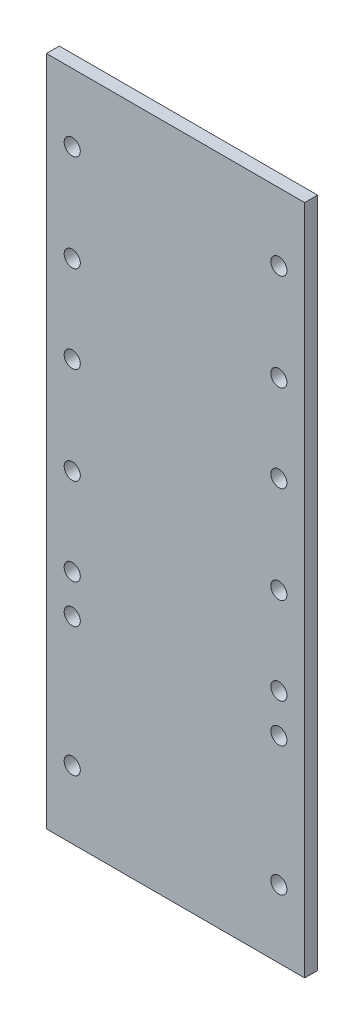
ISO-10303-21;
HEADER;
FILE_DESCRIPTION(('STEP AP214'),'2;1');
FILE_NAME('part.step','',(''),(''),'','','');
FILE_SCHEMA(('AUTOMOTIVE_DESIGN { 1 0 10303 214 1 1 1 1 }'));
ENDSEC;
DATA;
#1=APPLICATION_CONTEXT('core data for automotive mechanical design processes');
#2=APPLICATION_PROTOCOL_DEFINITION('international standard','automotive_design',2000,#1);
#3=PRODUCT_CONTEXT('',#1,'mechanical');
#4=PRODUCT('Part','Part','',(#3));
#5=PRODUCT_RELATED_PRODUCT_CATEGORY('part','',(#4));
#6=PRODUCT_DEFINITION_FORMATION('','',#4);
#7=PRODUCT_DEFINITION_CONTEXT('part definition',#1,'design');
#8=PRODUCT_DEFINITION('design','',#6,#7);
#9=PRODUCT_DEFINITION_SHAPE('','',#8);
#10=(LENGTH_UNIT() NAMED_UNIT(*) SI_UNIT(.MILLI.,.METRE.));
#11=(NAMED_UNIT(*) PLANE_ANGLE_UNIT() SI_UNIT($,.RADIAN.));
#12=(NAMED_UNIT(*) SI_UNIT($,.STERADIAN.) SOLID_ANGLE_UNIT());
#13=UNCERTAINTY_MEASURE_WITH_UNIT(LENGTH_MEASURE(1.E-05),#10,'distance_accuracy_value','');
#14=(GEOMETRIC_REPRESENTATION_CONTEXT(3) GLOBAL_UNCERTAINTY_ASSIGNED_CONTEXT((#13)) GLOBAL_UNIT_ASSIGNED_CONTEXT((#10,
#11,#12)) REPRESENTATION_CONTEXT('',''));
#15=CARTESIAN_POINT('',(0.,0.,0.));
#16=DIRECTION('',(0.,0.,1.));
#17=DIRECTION('',(1.,0.,0.));
#18=AXIS2_PLACEMENT_3D('',#15,#16,#17);
#19=CARTESIAN_POINT('',(0.,0.,4.));
#20=DIRECTION('',(0.,0.,1.));
#21=DIRECTION('',(1.,0.,0.));
#22=AXIS2_PLACEMENT_3D('',#19,#20,#21);
#23=PLANE('',#22);
#24=CARTESIAN_POINT('',(89.9081608098103,-91.7509432379259,4.));
#25=DIRECTION('',(0.,0.,1.));
#26=DIRECTION('',(1.,0.,0.));
#27=AXIS2_PLACEMENT_3D('',#24,#25,#26);
#28=CIRCLE('',#27,2.5);
#29=CARTESIAN_POINT('',(92.4081608098103,-91.7509432379259,4.));
#30=VERTEX_POINT('',#29);
#31=EDGE_CURVE('E191',#30,#30,#28,.T.);
#32=ORIENTED_EDGE('',*,*,#31,.F.);
#33=EDGE_LOOP('',(#32));
#34=FACE_BOUND('',#33,.T.);
#35=CARTESIAN_POINT('',(89.9081608098103,-34.7509432379258,4.));
#36=DIRECTION('',(0.,0.,1.));
#37=DIRECTION('',(1.,0.,0.));
#38=AXIS2_PLACEMENT_3D('',#35,#36,#37);
#39=CIRCLE('',#38,2.5);
#40=CARTESIAN_POINT('',(92.4081608098103,-34.7509432379258,4.));
#41=VERTEX_POINT('',#40);
#42=EDGE_CURVE('E179',#41,#41,#39,.T.);
#43=ORIENTED_EDGE('',*,*,#42,.F.);
#44=EDGE_LOOP('',(#43));
#45=FACE_BOUND('',#44,.T.);
#46=CARTESIAN_POINT('',(89.9081608098103,-61.7509432379258,4.));
#47=DIRECTION('',(0.,0.,1.));
#48=DIRECTION('',(1.,0.,0.));
#49=AXIS2_PLACEMENT_3D('',#46,#47,#48);
#50=CIRCLE('',#49,2.5);
#51=CARTESIAN_POINT('',(92.4081608098103,-61.7509432379258,4.));
#52=VERTEX_POINT('',#51);
#53=EDGE_CURVE('E167',#52,#52,#50,.T.);
#54=ORIENTED_EDGE('',*,*,#53,.F.);
#55=EDGE_LOOP('',(#54));
#56=FACE_BOUND('',#55,.T.);
#57=CARTESIAN_POINT('',(89.9081608098103,-118.750943237926,4.));
#58=DIRECTION('',(0.,0.,1.));
#59=DIRECTION('',(1.,0.,0.));
#60=AXIS2_PLACEMENT_3D('',#57,#58,#59);
#61=CIRCLE('',#60,2.5);
#62=CARTESIAN_POINT('',(92.4081608098103,-118.750943237926,4.));
#63=VERTEX_POINT('',#62);
#64=EDGE_CURVE('E155',#63,#63,#61,.T.);
#65=ORIENTED_EDGE('',*,*,#64,.F.);
#66=EDGE_LOOP('',(#65));
#67=FACE_BOUND('',#66,.T.);
#68=CARTESIAN_POINT('',(89.9081608098103,-130.750943237926,4.));
#69=DIRECTION('',(0.,0.,1.));
#70=DIRECTION('',(1.,0.,0.));
#71=AXIS2_PLACEMENT_3D('',#68,#69,#70);
#72=CIRCLE('',#71,2.5);
#73=CARTESIAN_POINT('',(92.4081608098103,-130.750943237926,4.));
#74=VERTEX_POINT('',#73);
#75=EDGE_CURVE('E143',#74,#74,#72,.T.);
#76=ORIENTED_EDGE('',*,*,#75,.F.);
#77=EDGE_LOOP('',(#76));
#78=FACE_BOUND('',#77,.T.);
#79=CARTESIAN_POINT('',(89.9081608098103,-170.750943237926,4.));
#80=DIRECTION('',(0.,0.,1.));
#81=DIRECTION('',(1.,0.,0.));
#82=AXIS2_PLACEMENT_3D('',#79,#80,#81);
#83=CIRCLE('',#82,2.5);
#84=CARTESIAN_POINT('',(92.4081608098103,-170.750943237926,4.));
#85=VERTEX_POINT('',#84);
#86=EDGE_CURVE('E131',#85,#85,#83,.T.);
#87=ORIENTED_EDGE('',*,*,#86,.F.);
#88=EDGE_LOOP('',(#87));
#89=FACE_BOUND('',#88,.T.);
#90=CARTESIAN_POINT('',(25.9081608098103,-4.75094323792584,4.));
#91=DIRECTION('',(0.,0.,1.));
#92=DIRECTION('',(1.,0.,0.));
#93=AXIS2_PLACEMENT_3D('',#90,#91,#92);
#94=CIRCLE('',#93,2.49999999999999);
#95=CARTESIAN_POINT('',(28.4081608098103,-4.75094323792584,4.));
#96=VERTEX_POINT('',#95);
#97=EDGE_CURVE('E110',#96,#96,#94,.T.);
#98=ORIENTED_EDGE('',*,*,#97,.F.);
#99=EDGE_LOOP('',(#98));
#100=FACE_BOUND('',#99,.T.);
#101=DIRECTION('',(0.,-1.,0.));
#102=VECTOR('',#101,1.);
#103=CARTESIAN_POINT('',(17.9081608098103,16.2490567620742,4.));
#104=LINE('',#103,#102);
#105=CARTESIAN_POINT('',(17.9081608098103,16.2490567620742,4.));
#106=VERTEX_POINT('',#105);
#107=CARTESIAN_POINT('',(17.9081608098103,-191.750943237926,4.));
#108=VERTEX_POINT('',#107);
#109=EDGE_CURVE('E95',#106,#108,#104,.T.);
#110=ORIENTED_EDGE('',*,*,#109,.T.);
#111=DIRECTION('',(1.,0.,0.));
#112=VECTOR('',#111,1.);
#113=CARTESIAN_POINT('',(17.9081608098103,-191.750943237926,4.));
#114=LINE('',#113,#112);
#115=CARTESIAN_POINT('',(97.9081608098104,-191.750943237926,4.));
#116=VERTEX_POINT('',#115);
#117=EDGE_CURVE('E90',#108,#116,#114,.T.);
#118=ORIENTED_EDGE('',*,*,#117,.T.);
#119=DIRECTION('',(0.,1.,0.));
#120=VECTOR('',#119,1.);
#121=CARTESIAN_POINT('',(97.9081608098103,16.2490567620742,4.));
#122=LINE('',#121,#120);
#123=CARTESIAN_POINT('',(97.9081608098103,16.2490567620742,4.));
#124=VERTEX_POINT('',#123);
#125=EDGE_CURVE('E93',#116,#124,#122,.T.);
#126=ORIENTED_EDGE('',*,*,#125,.T.);
#127=DIRECTION('',(-1.,0.,0.));
#128=VECTOR('',#127,1.);
#129=CARTESIAN_POINT('',(17.9081608098103,16.2490567620742,4.));
#130=LINE('',#129,#128);
#131=EDGE_CURVE('E60',#124,#106,#130,.T.);
#132=ORIENTED_EDGE('',*,*,#131,.T.);
#133=EDGE_LOOP('',(#110,#118,#126,#132));
#134=FACE_BOUND('',#133,.T.);
#135=CARTESIAN_POINT('',(89.9081608098103,-4.75094323792584,4.));
#136=DIRECTION('',(0.,0.,1.));
#137=DIRECTION('',(1.,0.,0.));
#138=AXIS2_PLACEMENT_3D('',#135,#136,#137);
#139=CIRCLE('',#138,2.5);
#140=CARTESIAN_POINT('',(92.4081608098103,-4.75094323792584,4.));
#141=VERTEX_POINT('',#140);
#142=EDGE_CURVE('E125',#141,#141,#139,.T.);
#143=ORIENTED_EDGE('',*,*,#142,.F.);
#144=EDGE_LOOP('',(#143));
#145=FACE_BOUND('',#144,.T.);
#146=CARTESIAN_POINT('',(25.9081608098103,-170.750943237926,4.));
#147=DIRECTION('',(0.,0.,1.));
#148=DIRECTION('',(1.,0.,0.));
#149=AXIS2_PLACEMENT_3D('',#146,#147,#148);
#150=CIRCLE('',#149,2.5);
#151=CARTESIAN_POINT('',(28.4081608098103,-170.750943237926,4.));
#152=VERTEX_POINT('',#151);
#153=EDGE_CURVE('E137',#152,#152,#150,.T.);
#154=ORIENTED_EDGE('',*,*,#153,.F.);
#155=EDGE_LOOP('',(#154));
#156=FACE_BOUND('',#155,.T.);
#157=CARTESIAN_POINT('',(25.9081608098103,-130.750943237926,4.));
#158=DIRECTION('',(0.,0.,1.));
#159=DIRECTION('',(1.,0.,0.));
#160=AXIS2_PLACEMENT_3D('',#157,#158,#159);
#161=CIRCLE('',#160,2.5);
#162=CARTESIAN_POINT('',(28.4081608098103,-130.750943237926,4.));
#163=VERTEX_POINT('',#162);
#164=EDGE_CURVE('E149',#163,#163,#161,.T.);
#165=ORIENTED_EDGE('',*,*,#164,.F.);
#166=EDGE_LOOP('',(#165));
#167=FACE_BOUND('',#166,.T.);
#168=CARTESIAN_POINT('',(25.9081608098103,-118.750943237926,4.));
#169=DIRECTION('',(0.,0.,1.));
#170=DIRECTION('',(1.,0.,0.));
#171=AXIS2_PLACEMENT_3D('',#168,#169,#170);
#172=CIRCLE('',#171,2.5);
#173=CARTESIAN_POINT('',(28.4081608098103,-118.750943237926,4.));
#174=VERTEX_POINT('',#173);
#175=EDGE_CURVE('E161',#174,#174,#172,.T.);
#176=ORIENTED_EDGE('',*,*,#175,.F.);
#177=EDGE_LOOP('',(#176));
#178=FACE_BOUND('',#177,.T.);
#179=CARTESIAN_POINT('',(25.9081608098103,-61.7509432379258,4.));
#180=DIRECTION('',(0.,0.,1.));
#181=DIRECTION('',(1.,0.,0.));
#182=AXIS2_PLACEMENT_3D('',#179,#180,#181);
#183=CIRCLE('',#182,2.5);
#184=CARTESIAN_POINT('',(28.4081608098103,-61.7509432379258,4.));
#185=VERTEX_POINT('',#184);
#186=EDGE_CURVE('E173',#185,#185,#183,.T.);
#187=ORIENTED_EDGE('',*,*,#186,.F.);
#188=EDGE_LOOP('',(#187));
#189=FACE_BOUND('',#188,.T.);
#190=CARTESIAN_POINT('',(25.9081608098103,-34.7509432379258,4.));
#191=DIRECTION('',(0.,0.,1.));
#192=DIRECTION('',(1.,0.,0.));
#193=AXIS2_PLACEMENT_3D('',#190,#191,#192);
#194=CIRCLE('',#193,2.5);
#195=CARTESIAN_POINT('',(28.4081608098103,-34.7509432379258,4.));
#196=VERTEX_POINT('',#195);
#197=EDGE_CURVE('E185',#196,#196,#194,.T.);
#198=ORIENTED_EDGE('',*,*,#197,.F.);
#199=EDGE_LOOP('',(#198));
#200=FACE_BOUND('',#199,.T.);
#201=CARTESIAN_POINT('',(25.9081608098103,-91.7509432379259,4.));
#202=DIRECTION('',(0.,0.,1.));
#203=DIRECTION('',(1.,0.,0.));
#204=AXIS2_PLACEMENT_3D('',#201,#202,#203);
#205=CIRCLE('',#204,2.5);
#206=CARTESIAN_POINT('',(28.4081608098103,-91.7509432379259,4.));
#207=VERTEX_POINT('',#206);
#208=EDGE_CURVE('E197',#207,#207,#205,.T.);
#209=ORIENTED_EDGE('',*,*,#208,.F.);
#210=EDGE_LOOP('',(#209));
#211=FACE_BOUND('',#210,.T.);
#212=ADVANCED_FACE('F43',(#34,#45,#56,#67,#78,#89,#100,#134,#145,#156,#167,#178,#189,#200,#211),
#23,.T.);
#213=CARTESIAN_POINT('',(0.,0.,0.));
#214=DIRECTION('',(0.,0.,1.));
#215=DIRECTION('',(1.,0.,0.));
#216=AXIS2_PLACEMENT_3D('',#213,#214,#215);
#217=PLANE('',#216);
#218=DIRECTION('',(0.,-1.,0.));
#219=VECTOR('',#218,1.);
#220=CARTESIAN_POINT('',(17.9081608098103,16.2490567620742,0.));
#221=LINE('',#220,#219);
#222=CARTESIAN_POINT('',(17.9081608098103,16.2490567620742,0.));
#223=VERTEX_POINT('',#222);
#224=CARTESIAN_POINT('',(17.9081608098103,-191.750943237926,0.));
#225=VERTEX_POINT('',#224);
#226=EDGE_CURVE('E107',#223,#225,#221,.T.);
#227=ORIENTED_EDGE('',*,*,#226,.F.);
#228=DIRECTION('',(-1.,0.,0.));
#229=VECTOR('',#228,1.);
#230=CARTESIAN_POINT('',(17.9081608098103,16.2490567620742,0.));
#231=LINE('',#230,#229);
#232=CARTESIAN_POINT('',(97.9081608098103,16.2490567620742,0.));
#233=VERTEX_POINT('',#232);
#234=EDGE_CURVE('E83',#233,#223,#231,.T.);
#235=ORIENTED_EDGE('',*,*,#234,.F.);
#236=DIRECTION('',(0.,1.,0.));
#237=VECTOR('',#236,1.);
#238=CARTESIAN_POINT('',(97.9081608098103,16.2490567620742,0.));
#239=LINE('',#238,#237);
#240=CARTESIAN_POINT('',(97.9081608098104,-191.750943237926,0.));
#241=VERTEX_POINT('',#240);
#242=EDGE_CURVE('E77',#241,#233,#239,.T.);
#243=ORIENTED_EDGE('',*,*,#242,.F.);
#244=DIRECTION('',(1.,0.,0.));
#245=VECTOR('',#244,1.);
#246=CARTESIAN_POINT('',(17.9081608098103,-191.750943237926,0.));
#247=LINE('',#246,#245);
#248=EDGE_CURVE('E99',#225,#241,#247,.T.);
#249=ORIENTED_EDGE('',*,*,#248,.F.);
#250=EDGE_LOOP('',(#227,#235,#243,#249));
#251=FACE_BOUND('',#250,.T.);
#252=CARTESIAN_POINT('',(25.9081608098103,-4.75094323792584,0.));
#253=DIRECTION('',(0.,0.,1.));
#254=DIRECTION('',(1.,0.,0.));
#255=AXIS2_PLACEMENT_3D('',#252,#253,#254);
#256=CIRCLE('',#255,2.49999999999999);
#257=CARTESIAN_POINT('',(28.4081608098103,-4.75094323792584,0.));
#258=VERTEX_POINT('',#257);
#259=EDGE_CURVE('E122',#258,#258,#256,.T.);
#260=ORIENTED_EDGE('',*,*,#259,.T.);
#261=EDGE_LOOP('',(#260));
#262=FACE_BOUND('',#261,.T.);
#263=CARTESIAN_POINT('',(89.9081608098103,-4.75094323792584,0.));
#264=DIRECTION('',(0.,0.,1.));
#265=DIRECTION('',(1.,0.,0.));
#266=AXIS2_PLACEMENT_3D('',#263,#264,#265);
#267=CIRCLE('',#266,2.5);
#268=CARTESIAN_POINT('',(92.4081608098103,-4.75094323792584,0.));
#269=VERTEX_POINT('',#268);
#270=EDGE_CURVE('E128',#269,#269,#267,.T.);
#271=ORIENTED_EDGE('',*,*,#270,.T.);
#272=EDGE_LOOP('',(#271));
#273=FACE_BOUND('',#272,.T.);
#274=CARTESIAN_POINT('',(89.9081608098103,-170.750943237926,0.));
#275=DIRECTION('',(0.,0.,1.));
#276=DIRECTION('',(1.,0.,0.));
#277=AXIS2_PLACEMENT_3D('',#274,#275,#276);
#278=CIRCLE('',#277,2.5);
#279=CARTESIAN_POINT('',(92.4081608098103,-170.750943237926,0.));
#280=VERTEX_POINT('',#279);
#281=EDGE_CURVE('E134',#280,#280,#278,.T.);
#282=ORIENTED_EDGE('',*,*,#281,.T.);
#283=EDGE_LOOP('',(#282));
#284=FACE_BOUND('',#283,.T.);
#285=CARTESIAN_POINT('',(25.9081608098103,-170.750943237926,0.));
#286=DIRECTION('',(0.,0.,1.));
#287=DIRECTION('',(1.,0.,0.));
#288=AXIS2_PLACEMENT_3D('',#285,#286,#287);
#289=CIRCLE('',#288,2.5);
#290=CARTESIAN_POINT('',(28.4081608098103,-170.750943237926,0.));
#291=VERTEX_POINT('',#290);
#292=EDGE_CURVE('E140',#291,#291,#289,.T.);
#293=ORIENTED_EDGE('',*,*,#292,.T.);
#294=EDGE_LOOP('',(#293));
#295=FACE_BOUND('',#294,.T.);
#296=CARTESIAN_POINT('',(89.9081608098103,-130.750943237926,0.));
#297=DIRECTION('',(0.,0.,1.));
#298=DIRECTION('',(1.,0.,0.));
#299=AXIS2_PLACEMENT_3D('',#296,#297,#298);
#300=CIRCLE('',#299,2.5);
#301=CARTESIAN_POINT('',(92.4081608098103,-130.750943237926,0.));
#302=VERTEX_POINT('',#301);
#303=EDGE_CURVE('E146',#302,#302,#300,.T.);
#304=ORIENTED_EDGE('',*,*,#303,.T.);
#305=EDGE_LOOP('',(#304));
#306=FACE_BOUND('',#305,.T.);
#307=CARTESIAN_POINT('',(25.9081608098103,-130.750943237926,0.));
#308=DIRECTION('',(0.,0.,1.));
#309=DIRECTION('',(1.,0.,0.));
#310=AXIS2_PLACEMENT_3D('',#307,#308,#309);
#311=CIRCLE('',#310,2.5);
#312=CARTESIAN_POINT('',(28.4081608098103,-130.750943237926,0.));
#313=VERTEX_POINT('',#312);
#314=EDGE_CURVE('E152',#313,#313,#311,.T.);
#315=ORIENTED_EDGE('',*,*,#314,.T.);
#316=EDGE_LOOP('',(#315));
#317=FACE_BOUND('',#316,.T.);
#318=CARTESIAN_POINT('',(89.9081608098103,-118.750943237926,0.));
#319=DIRECTION('',(0.,0.,1.));
#320=DIRECTION('',(1.,0.,0.));
#321=AXIS2_PLACEMENT_3D('',#318,#319,#320);
#322=CIRCLE('',#321,2.5);
#323=CARTESIAN_POINT('',(92.4081608098103,-118.750943237926,0.));
#324=VERTEX_POINT('',#323);
#325=EDGE_CURVE('E158',#324,#324,#322,.T.);
#326=ORIENTED_EDGE('',*,*,#325,.T.);
#327=EDGE_LOOP('',(#326));
#328=FACE_BOUND('',#327,.T.);
#329=CARTESIAN_POINT('',(25.9081608098103,-118.750943237926,0.));
#330=DIRECTION('',(0.,0.,1.));
#331=DIRECTION('',(1.,0.,0.));
#332=AXIS2_PLACEMENT_3D('',#329,#330,#331);
#333=CIRCLE('',#332,2.5);
#334=CARTESIAN_POINT('',(28.4081608098103,-118.750943237926,0.));
#335=VERTEX_POINT('',#334);
#336=EDGE_CURVE('E164',#335,#335,#333,.T.);
#337=ORIENTED_EDGE('',*,*,#336,.T.);
#338=EDGE_LOOP('',(#337));
#339=FACE_BOUND('',#338,.T.);
#340=CARTESIAN_POINT('',(89.9081608098103,-61.7509432379258,0.));
#341=DIRECTION('',(0.,0.,1.));
#342=DIRECTION('',(1.,0.,0.));
#343=AXIS2_PLACEMENT_3D('',#340,#341,#342);
#344=CIRCLE('',#343,2.5);
#345=CARTESIAN_POINT('',(92.4081608098103,-61.7509432379258,0.));
#346=VERTEX_POINT('',#345);
#347=EDGE_CURVE('E170',#346,#346,#344,.T.);
#348=ORIENTED_EDGE('',*,*,#347,.T.);
#349=EDGE_LOOP('',(#348));
#350=FACE_BOUND('',#349,.T.);
#351=CARTESIAN_POINT('',(25.9081608098103,-61.7509432379258,0.));
#352=DIRECTION('',(0.,0.,1.));
#353=DIRECTION('',(1.,0.,0.));
#354=AXIS2_PLACEMENT_3D('',#351,#352,#353);
#355=CIRCLE('',#354,2.5);
#356=CARTESIAN_POINT('',(28.4081608098103,-61.7509432379258,0.));
#357=VERTEX_POINT('',#356);
#358=EDGE_CURVE('E176',#357,#357,#355,.T.);
#359=ORIENTED_EDGE('',*,*,#358,.T.);
#360=EDGE_LOOP('',(#359));
#361=FACE_BOUND('',#360,.T.);
#362=CARTESIAN_POINT('',(89.9081608098103,-34.7509432379258,0.));
#363=DIRECTION('',(0.,0.,1.));
#364=DIRECTION('',(1.,0.,0.));
#365=AXIS2_PLACEMENT_3D('',#362,#363,#364);
#366=CIRCLE('',#365,2.5);
#367=CARTESIAN_POINT('',(92.4081608098103,-34.7509432379258,0.));
#368=VERTEX_POINT('',#367);
#369=EDGE_CURVE('E182',#368,#368,#366,.T.);
#370=ORIENTED_EDGE('',*,*,#369,.T.);
#371=EDGE_LOOP('',(#370));
#372=FACE_BOUND('',#371,.T.);
#373=CARTESIAN_POINT('',(25.9081608098103,-34.7509432379258,0.));
#374=DIRECTION('',(0.,0.,1.));
#375=DIRECTION('',(1.,0.,0.));
#376=AXIS2_PLACEMENT_3D('',#373,#374,#375);
#377=CIRCLE('',#376,2.5);
#378=CARTESIAN_POINT('',(28.4081608098103,-34.7509432379258,0.));
#379=VERTEX_POINT('',#378);
#380=EDGE_CURVE('E188',#379,#379,#377,.T.);
#381=ORIENTED_EDGE('',*,*,#380,.T.);
#382=EDGE_LOOP('',(#381));
#383=FACE_BOUND('',#382,.T.);
#384=CARTESIAN_POINT('',(89.9081608098103,-91.7509432379259,0.));
#385=DIRECTION('',(0.,0.,1.));
#386=DIRECTION('',(1.,0.,0.));
#387=AXIS2_PLACEMENT_3D('',#384,#385,#386);
#388=CIRCLE('',#387,2.5);
#389=CARTESIAN_POINT('',(92.4081608098103,-91.7509432379259,0.));
#390=VERTEX_POINT('',#389);
#391=EDGE_CURVE('E194',#390,#390,#388,.T.);
#392=ORIENTED_EDGE('',*,*,#391,.T.);
#393=EDGE_LOOP('',(#392));
#394=FACE_BOUND('',#393,.T.);
#395=CARTESIAN_POINT('',(25.9081608098103,-91.7509432379259,0.));
#396=DIRECTION('',(0.,0.,1.));
#397=DIRECTION('',(1.,0.,0.));
#398=AXIS2_PLACEMENT_3D('',#395,#396,#397);
#399=CIRCLE('',#398,2.5);
#400=CARTESIAN_POINT('',(28.4081608098103,-91.7509432379259,0.));
#401=VERTEX_POINT('',#400);
#402=EDGE_CURVE('E200',#401,#401,#399,.T.);
#403=ORIENTED_EDGE('',*,*,#402,.T.);
#404=EDGE_LOOP('',(#403));
#405=FACE_BOUND('',#404,.T.);
#406=ADVANCED_FACE('F118',(#251,#262,#273,#284,#295,#306,#317,#328,#339,#350,#361,#372,#383,
#394,#405),#217,.F.);
#407=CARTESIAN_POINT('',(17.9081608098103,16.2490567620742,4.));
#408=DIRECTION('',(1.,0.,0.));
#409=DIRECTION('',(0.,1.,0.));
#410=AXIS2_PLACEMENT_3D('',#407,#408,#409);
#411=PLANE('',#410);
#412=ORIENTED_EDGE('',*,*,#226,.T.);
#413=DIRECTION('',(0.,0.,-1.));
#414=VECTOR('',#413,1.);
#415=CARTESIAN_POINT('',(17.9081608098103,-191.750943237926,4.));
#416=LINE('',#415,#414);
#417=EDGE_CURVE('E13',#108,#225,#416,.T.);
#418=ORIENTED_EDGE('',*,*,#417,.F.);
#419=ORIENTED_EDGE('',*,*,#109,.F.);
#420=DIRECTION('',(0.,0.,-1.));
#421=VECTOR('',#420,1.);
#422=CARTESIAN_POINT('',(17.9081608098103,16.2490567620742,4.));
#423=LINE('',#422,#421);
#424=EDGE_CURVE('E103',#106,#223,#423,.T.);
#425=ORIENTED_EDGE('',*,*,#424,.T.);
#426=EDGE_LOOP('',(#412,#418,#419,#425));
#427=FACE_BOUND('',#426,.T.);
#428=ADVANCED_FACE('F45',(#427),#411,.F.);
#429=CARTESIAN_POINT('',(17.9081608098103,-191.750943237926,4.));
#430=DIRECTION('',(0.,1.,0.));
#431=DIRECTION('',(0.,0.,1.));
#432=AXIS2_PLACEMENT_3D('',#429,#430,#431);
#433=PLANE('',#432);
#434=ORIENTED_EDGE('',*,*,#248,.T.);
#435=DIRECTION('',(0.,0.,-1.));
#436=VECTOR('',#435,1.);
#437=CARTESIAN_POINT('',(97.9081608098104,-191.750943237926,4.));
#438=LINE('',#437,#436);
#439=EDGE_CURVE('E52',#116,#241,#438,.T.);
#440=ORIENTED_EDGE('',*,*,#439,.F.);
#441=ORIENTED_EDGE('',*,*,#117,.F.);
#442=ORIENTED_EDGE('',*,*,#417,.T.);
#443=EDGE_LOOP('',(#434,#440,#441,#442));
#444=FACE_BOUND('',#443,.T.);
#445=ADVANCED_FACE('F98',(#444),#433,.F.);
#446=CARTESIAN_POINT('',(97.9081608098103,16.2490567620742,4.));
#447=DIRECTION('',(-1.,0.,0.));
#448=DIRECTION('',(0.,-1.,0.));
#449=AXIS2_PLACEMENT_3D('',#446,#447,#448);
#450=PLANE('',#449);
#451=ORIENTED_EDGE('',*,*,#242,.T.);
#452=DIRECTION('',(0.,0.,-1.));
#453=VECTOR('',#452,1.);
#454=CARTESIAN_POINT('',(97.9081608098103,16.2490567620742,4.));
#455=LINE('',#454,#453);
#456=EDGE_CURVE('E100',#124,#233,#455,.T.);
#457=ORIENTED_EDGE('',*,*,#456,.F.);
#458=ORIENTED_EDGE('',*,*,#125,.F.);
#459=ORIENTED_EDGE('',*,*,#439,.T.);
#460=EDGE_LOOP('',(#451,#457,#458,#459));
#461=FACE_BOUND('',#460,.T.);
#462=ADVANCED_FACE('F101',(#461),#450,.F.);
#463=CARTESIAN_POINT('',(17.9081608098103,16.2490567620742,4.));
#464=DIRECTION('',(0.,-1.,0.));
#465=DIRECTION('',(0.,0.,-1.));
#466=AXIS2_PLACEMENT_3D('',#463,#464,#465);
#467=PLANE('',#466);
#468=ORIENTED_EDGE('',*,*,#234,.T.);
#469=ORIENTED_EDGE('',*,*,#424,.F.);
#470=ORIENTED_EDGE('',*,*,#131,.F.);
#471=ORIENTED_EDGE('',*,*,#456,.T.);
#472=EDGE_LOOP('',(#468,#469,#470,#471));
#473=FACE_BOUND('',#472,.T.);
#474=ADVANCED_FACE('F115',(#473),#467,.F.);
#475=CARTESIAN_POINT('',(25.9081608098103,-4.75094323792584,4.));
#476=DIRECTION('',(0.,0.,-1.));
#477=DIRECTION('',(-1.,0.,0.));
#478=AXIS2_PLACEMENT_3D('',#475,#476,#477);
#479=CYLINDRICAL_SURFACE('',#478,2.49999999999999);
#480=ORIENTED_EDGE('',*,*,#97,.T.);
#481=EDGE_LOOP('',(#480));
#482=FACE_BOUND('',#481,.T.);
#483=ORIENTED_EDGE('',*,*,#259,.F.);
#484=EDGE_LOOP('',(#483));
#485=FACE_BOUND('',#484,.T.);
#486=ADVANCED_FACE('F219',(#482,#485),#479,.F.);
#487=CARTESIAN_POINT('',(89.9081608098103,-4.75094323792584,4.));
#488=DIRECTION('',(0.,0.,-1.));
#489=DIRECTION('',(-1.,0.,0.));
#490=AXIS2_PLACEMENT_3D('',#487,#488,#489);
#491=CYLINDRICAL_SURFACE('',#490,2.5);
#492=ORIENTED_EDGE('',*,*,#142,.T.);
#493=EDGE_LOOP('',(#492));
#494=FACE_BOUND('',#493,.T.);
#495=ORIENTED_EDGE('',*,*,#270,.F.);
#496=EDGE_LOOP('',(#495));
#497=FACE_BOUND('',#496,.T.);
#498=ADVANCED_FACE('F265',(#494,#497),#491,.F.);
#499=CARTESIAN_POINT('',(89.9081608098103,-170.750943237926,4.));
#500=DIRECTION('',(0.,0.,-1.));
#501=DIRECTION('',(-1.,0.,0.));
#502=AXIS2_PLACEMENT_3D('',#499,#500,#501);
#503=CYLINDRICAL_SURFACE('',#502,2.5);
#504=ORIENTED_EDGE('',*,*,#86,.T.);
#505=EDGE_LOOP('',(#504));
#506=FACE_BOUND('',#505,.T.);
#507=ORIENTED_EDGE('',*,*,#281,.F.);
#508=EDGE_LOOP('',(#507));
#509=FACE_BOUND('',#508,.T.);
#510=ADVANCED_FACE('F273',(#506,#509),#503,.F.);
#511=CARTESIAN_POINT('',(25.9081608098103,-170.750943237926,4.));
#512=DIRECTION('',(0.,0.,-1.));
#513=DIRECTION('',(-1.,0.,0.));
#514=AXIS2_PLACEMENT_3D('',#511,#512,#513);
#515=CYLINDRICAL_SURFACE('',#514,2.5);
#516=ORIENTED_EDGE('',*,*,#153,.T.);
#517=EDGE_LOOP('',(#516));
#518=FACE_BOUND('',#517,.T.);
#519=ORIENTED_EDGE('',*,*,#292,.F.);
#520=EDGE_LOOP('',(#519));
#521=FACE_BOUND('',#520,.T.);
#522=ADVANCED_FACE('F281',(#518,#521),#515,.F.);
#523=CARTESIAN_POINT('',(89.9081608098103,-130.750943237926,4.));
#524=DIRECTION('',(0.,0.,-1.));
#525=DIRECTION('',(-1.,0.,0.));
#526=AXIS2_PLACEMENT_3D('',#523,#524,#525);
#527=CYLINDRICAL_SURFACE('',#526,2.5);
#528=ORIENTED_EDGE('',*,*,#75,.T.);
#529=EDGE_LOOP('',(#528));
#530=FACE_BOUND('',#529,.T.);
#531=ORIENTED_EDGE('',*,*,#303,.F.);
#532=EDGE_LOOP('',(#531));
#533=FACE_BOUND('',#532,.T.);
#534=ADVANCED_FACE('F290',(#530,#533),#527,.F.);
#535=CARTESIAN_POINT('',(25.9081608098103,-130.750943237926,4.));
#536=DIRECTION('',(0.,0.,-1.));
#537=DIRECTION('',(-1.,0.,0.));
#538=AXIS2_PLACEMENT_3D('',#535,#536,#537);
#539=CYLINDRICAL_SURFACE('',#538,2.5);
#540=ORIENTED_EDGE('',*,*,#164,.T.);
#541=EDGE_LOOP('',(#540));
#542=FACE_BOUND('',#541,.T.);
#543=ORIENTED_EDGE('',*,*,#314,.F.);
#544=EDGE_LOOP('',(#543));
#545=FACE_BOUND('',#544,.T.);
#546=ADVANCED_FACE('F299',(#542,#545),#539,.F.);
#547=CARTESIAN_POINT('',(89.9081608098103,-118.750943237926,4.));
#548=DIRECTION('',(0.,0.,-1.));
#549=DIRECTION('',(-1.,0.,0.));
#550=AXIS2_PLACEMENT_3D('',#547,#548,#549);
#551=CYLINDRICAL_SURFACE('',#550,2.5);
#552=ORIENTED_EDGE('',*,*,#64,.T.);
#553=EDGE_LOOP('',(#552));
#554=FACE_BOUND('',#553,.T.);
#555=ORIENTED_EDGE('',*,*,#325,.F.);
#556=EDGE_LOOP('',(#555));
#557=FACE_BOUND('',#556,.T.);
#558=ADVANCED_FACE('F308',(#554,#557),#551,.F.);
#559=CARTESIAN_POINT('',(25.9081608098103,-118.750943237926,4.));
#560=DIRECTION('',(0.,0.,-1.));
#561=DIRECTION('',(-1.,0.,0.));
#562=AXIS2_PLACEMENT_3D('',#559,#560,#561);
#563=CYLINDRICAL_SURFACE('',#562,2.5);
#564=ORIENTED_EDGE('',*,*,#175,.T.);
#565=EDGE_LOOP('',(#564));
#566=FACE_BOUND('',#565,.T.);
#567=ORIENTED_EDGE('',*,*,#336,.F.);
#568=EDGE_LOOP('',(#567));
#569=FACE_BOUND('',#568,.T.);
#570=ADVANCED_FACE('F317',(#566,#569),#563,.F.);
#571=CARTESIAN_POINT('',(89.9081608098103,-61.7509432379258,4.));
#572=DIRECTION('',(0.,0.,-1.));
#573=DIRECTION('',(-1.,0.,0.));
#574=AXIS2_PLACEMENT_3D('',#571,#572,#573);
#575=CYLINDRICAL_SURFACE('',#574,2.5);
#576=ORIENTED_EDGE('',*,*,#53,.T.);
#577=EDGE_LOOP('',(#576));
#578=FACE_BOUND('',#577,.T.);
#579=ORIENTED_EDGE('',*,*,#347,.F.);
#580=EDGE_LOOP('',(#579));
#581=FACE_BOUND('',#580,.T.);
#582=ADVANCED_FACE('F326',(#578,#581),#575,.F.);
#583=CARTESIAN_POINT('',(25.9081608098103,-61.7509432379258,4.));
#584=DIRECTION('',(0.,0.,-1.));
#585=DIRECTION('',(-1.,0.,0.));
#586=AXIS2_PLACEMENT_3D('',#583,#584,#585);
#587=CYLINDRICAL_SURFACE('',#586,2.5);
#588=ORIENTED_EDGE('',*,*,#186,.T.);
#589=EDGE_LOOP('',(#588));
#590=FACE_BOUND('',#589,.T.);
#591=ORIENTED_EDGE('',*,*,#358,.F.);
#592=EDGE_LOOP('',(#591));
#593=FACE_BOUND('',#592,.T.);
#594=ADVANCED_FACE('F335',(#590,#593),#587,.F.);
#595=CARTESIAN_POINT('',(89.9081608098103,-34.7509432379258,4.));
#596=DIRECTION('',(0.,0.,-1.));
#597=DIRECTION('',(-1.,0.,0.));
#598=AXIS2_PLACEMENT_3D('',#595,#596,#597);
#599=CYLINDRICAL_SURFACE('',#598,2.5);
#600=ORIENTED_EDGE('',*,*,#42,.T.);
#601=EDGE_LOOP('',(#600));
#602=FACE_BOUND('',#601,.T.);
#603=ORIENTED_EDGE('',*,*,#369,.F.);
#604=EDGE_LOOP('',(#603));
#605=FACE_BOUND('',#604,.T.);
#606=ADVANCED_FACE('F344',(#602,#605),#599,.F.);
#607=CARTESIAN_POINT('',(25.9081608098103,-34.7509432379258,4.));
#608=DIRECTION('',(0.,0.,-1.));
#609=DIRECTION('',(-1.,0.,0.));
#610=AXIS2_PLACEMENT_3D('',#607,#608,#609);
#611=CYLINDRICAL_SURFACE('',#610,2.5);
#612=ORIENTED_EDGE('',*,*,#197,.T.);
#613=EDGE_LOOP('',(#612));
#614=FACE_BOUND('',#613,.T.);
#615=ORIENTED_EDGE('',*,*,#380,.F.);
#616=EDGE_LOOP('',(#615));
#617=FACE_BOUND('',#616,.T.);
#618=ADVANCED_FACE('F353',(#614,#617),#611,.F.);
#619=CARTESIAN_POINT('',(89.9081608098103,-91.7509432379259,4.));
#620=DIRECTION('',(0.,0.,-1.));
#621=DIRECTION('',(-1.,0.,0.));
#622=AXIS2_PLACEMENT_3D('',#619,#620,#621);
#623=CYLINDRICAL_SURFACE('',#622,2.5);
#624=ORIENTED_EDGE('',*,*,#31,.T.);
#625=EDGE_LOOP('',(#624));
#626=FACE_BOUND('',#625,.T.);
#627=ORIENTED_EDGE('',*,*,#391,.F.);
#628=EDGE_LOOP('',(#627));
#629=FACE_BOUND('',#628,.T.);
#630=ADVANCED_FACE('F362',(#626,#629),#623,.F.);
#631=CARTESIAN_POINT('',(25.9081608098103,-91.7509432379259,4.));
#632=DIRECTION('',(0.,0.,-1.));
#633=DIRECTION('',(-1.,0.,0.));
#634=AXIS2_PLACEMENT_3D('',#631,#632,#633);
#635=CYLINDRICAL_SURFACE('',#634,2.5);
#636=ORIENTED_EDGE('',*,*,#208,.T.);
#637=EDGE_LOOP('',(#636));
#638=FACE_BOUND('',#637,.T.);
#639=ORIENTED_EDGE('',*,*,#402,.F.);
#640=EDGE_LOOP('',(#639));
#641=FACE_BOUND('',#640,.T.);
#642=ADVANCED_FACE('F206',(#638,#641),#635,.F.);
#643=CLOSED_SHELL('',(#212,#406,#428,#445,#462,#474,#486,#498,#510,#522,#534,#546,#558,#570,
#582,#594,#606,#618,#630,#642));
#644=MANIFOLD_SOLID_BREP('B2',#643);
#645=ADVANCED_BREP_SHAPE_REPRESENTATION('',(#18,#644),#14);
#646=SHAPE_DEFINITION_REPRESENTATION(#9,#645);
ENDSEC;
END-ISO-10303-21;
